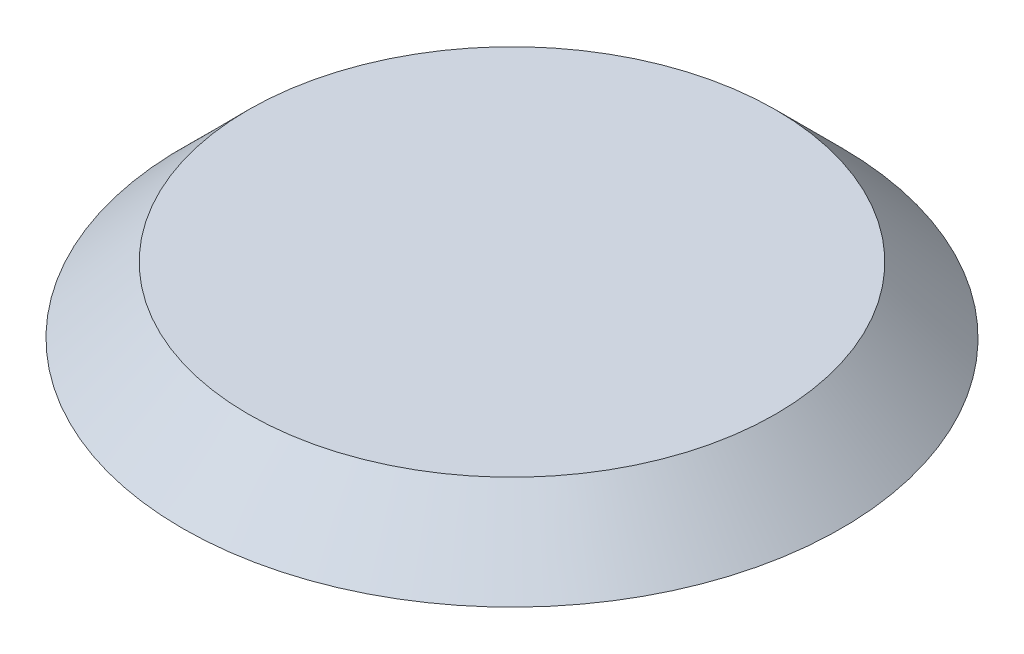
ISO-10303-21;
HEADER;
FILE_DESCRIPTION(('STEP AP214'),'2;1');
FILE_NAME('part.step','',(''),(''),'','','');
FILE_SCHEMA(('AUTOMOTIVE_DESIGN { 1 0 10303 214 1 1 1 1 }'));
ENDSEC;
DATA;
#1=APPLICATION_CONTEXT('core data for automotive mechanical design processes');
#2=APPLICATION_PROTOCOL_DEFINITION('international standard','automotive_design',2000,#1);
#3=PRODUCT_CONTEXT('',#1,'mechanical');
#4=PRODUCT('Part','Part','',(#3));
#5=PRODUCT_RELATED_PRODUCT_CATEGORY('part','',(#4));
#6=PRODUCT_DEFINITION_FORMATION('','',#4);
#7=PRODUCT_DEFINITION_CONTEXT('part definition',#1,'design');
#8=PRODUCT_DEFINITION('design','',#6,#7);
#9=PRODUCT_DEFINITION_SHAPE('','',#8);
#10=(LENGTH_UNIT() NAMED_UNIT(*) SI_UNIT(.MILLI.,.METRE.));
#11=(NAMED_UNIT(*) PLANE_ANGLE_UNIT() SI_UNIT($,.RADIAN.));
#12=(NAMED_UNIT(*) SI_UNIT($,.STERADIAN.) SOLID_ANGLE_UNIT());
#13=UNCERTAINTY_MEASURE_WITH_UNIT(LENGTH_MEASURE(1.E-05),#10,'distance_accuracy_value','');
#14=(GEOMETRIC_REPRESENTATION_CONTEXT(3) GLOBAL_UNCERTAINTY_ASSIGNED_CONTEXT((#13)) GLOBAL_UNIT_ASSIGNED_CONTEXT((#10,
#11,#12)) REPRESENTATION_CONTEXT('',''));
#15=CARTESIAN_POINT('',(0.,0.,0.));
#16=DIRECTION('',(0.,0.,1.));
#17=DIRECTION('',(1.,0.,0.));
#18=AXIS2_PLACEMENT_3D('',#15,#16,#17);
#19=CARTESIAN_POINT('',(0.,3.,0.));
#20=DIRECTION('',(0.,1.,0.));
#21=DIRECTION('',(0.,0.,1.));
#22=AXIS2_PLACEMENT_3D('',#19,#20,#21);
#23=PLANE('',#22);
#24=CARTESIAN_POINT('',(0.,3.,0.));
#25=DIRECTION('',(0.,1.,0.));
#26=DIRECTION('',(0.,0.,1.));
#27=AXIS2_PLACEMENT_3D('',#24,#25,#26);
#28=CIRCLE('',#27,12.);
#29=CARTESIAN_POINT('',(0.,3.,-12.));
#30=VERTEX_POINT('',#29);
#31=EDGE_CURVE('E10',#30,#30,#28,.T.);
#32=ORIENTED_EDGE('',*,*,#31,.T.);
#33=EDGE_LOOP('',(#32));
#34=FACE_BOUND('',#33,.T.);
#35=ADVANCED_FACE('F31',(#34),#23,.T.);
#36=CARTESIAN_POINT('',(0.,0.,0.));
#37=DIRECTION('',(0.,1.,0.));
#38=DIRECTION('',(0.,0.,1.));
#39=AXIS2_PLACEMENT_3D('',#36,#37,#38);
#40=PLANE('',#39);
#41=CARTESIAN_POINT('',(0.,0.,0.));
#42=DIRECTION('',(0.,1.,0.));
#43=DIRECTION('',(0.,0.,1.));
#44=AXIS2_PLACEMENT_3D('',#41,#42,#43);
#45=CIRCLE('',#44,15.);
#46=CARTESIAN_POINT('',(0.,0.,-15.));
#47=VERTEX_POINT('',#46);
#48=EDGE_CURVE('E38',#47,#47,#45,.T.);
#49=ORIENTED_EDGE('',*,*,#48,.F.);
#50=EDGE_LOOP('',(#49));
#51=FACE_BOUND('',#50,.T.);
#52=ADVANCED_FACE('F46',(#51),#40,.F.);
#53=CARTESIAN_POINT('',(0.,3.,0.));
#54=DIRECTION('',(0.,-1.,0.));
#55=DIRECTION('',(0.,0.,-1.));
#56=AXIS2_PLACEMENT_3D('',#53,#54,#55);
#57=CONICAL_SURFACE('',#56,12.,0.785398163397448);
#58=CARTESIAN_POINT('',(0.,0.,-15.));
#59=CARTESIAN_POINT('',(0.,0.0312499999999996,-14.96875));
#60=CARTESIAN_POINT('',(0.,0.0624999999999996,-14.9375));
#61=CARTESIAN_POINT('',(0.,0.125,-14.875));
#62=CARTESIAN_POINT('',(0.,0.15625,-14.84375));
#63=CARTESIAN_POINT('',(0.,0.21875,-14.78125));
#64=CARTESIAN_POINT('',(0.,0.25,-14.75));
#65=CARTESIAN_POINT('',(0.,0.3125,-14.6875));
#66=CARTESIAN_POINT('',(0.,0.34375,-14.65625));
#67=CARTESIAN_POINT('',(0.,0.40625,-14.59375));
#68=CARTESIAN_POINT('',(0.,0.4375,-14.5625));
#69=CARTESIAN_POINT('',(0.,0.5,-14.5));
#70=CARTESIAN_POINT('',(0.,0.53125,-14.46875));
#71=CARTESIAN_POINT('',(0.,0.59375,-14.40625));
#72=CARTESIAN_POINT('',(0.,0.625,-14.375));
#73=CARTESIAN_POINT('',(0.,0.6875,-14.3125));
#74=CARTESIAN_POINT('',(0.,0.71875,-14.28125));
#75=CARTESIAN_POINT('',(0.,0.78125,-14.21875));
#76=CARTESIAN_POINT('',(0.,0.8125,-14.1875));
#77=CARTESIAN_POINT('',(0.,0.874999999999999,-14.125));
#78=CARTESIAN_POINT('',(0.,0.90625,-14.09375));
#79=CARTESIAN_POINT('',(0.,0.96875,-14.03125));
#80=CARTESIAN_POINT('',(0.,1.,-14.));
#81=CARTESIAN_POINT('',(0.,1.0625,-13.9375));
#82=CARTESIAN_POINT('',(0.,1.09375,-13.90625));
#83=CARTESIAN_POINT('',(0.,1.15625,-13.84375));
#84=CARTESIAN_POINT('',(0.,1.1875,-13.8125));
#85=CARTESIAN_POINT('',(0.,1.25,-13.75));
#86=CARTESIAN_POINT('',(0.,1.28125,-13.71875));
#87=CARTESIAN_POINT('',(0.,1.34375,-13.65625));
#88=CARTESIAN_POINT('',(0.,1.375,-13.625));
#89=CARTESIAN_POINT('',(0.,1.4375,-13.5625));
#90=CARTESIAN_POINT('',(0.,1.46875,-13.53125));
#91=CARTESIAN_POINT('',(0.,1.53125,-13.46875));
#92=CARTESIAN_POINT('',(0.,1.5625,-13.4375));
#93=CARTESIAN_POINT('',(0.,1.625,-13.375));
#94=CARTESIAN_POINT('',(0.,1.65625,-13.34375));
#95=CARTESIAN_POINT('',(0.,1.71875,-13.28125));
#96=CARTESIAN_POINT('',(0.,1.75,-13.25));
#97=CARTESIAN_POINT('',(0.,1.8125,-13.1875));
#98=CARTESIAN_POINT('',(0.,1.84375,-13.15625));
#99=CARTESIAN_POINT('',(0.,1.90625,-13.09375));
#100=CARTESIAN_POINT('',(0.,1.9375,-13.0625));
#101=CARTESIAN_POINT('',(0.,2.,-13.));
#102=CARTESIAN_POINT('',(0.,2.03125,-12.96875));
#103=CARTESIAN_POINT('',(0.,2.09375,-12.90625));
#104=CARTESIAN_POINT('',(0.,2.125,-12.875));
#105=CARTESIAN_POINT('',(0.,2.1875,-12.8125));
#106=CARTESIAN_POINT('',(0.,2.21875,-12.78125));
#107=CARTESIAN_POINT('',(0.,2.28125,-12.71875));
#108=CARTESIAN_POINT('',(0.,2.3125,-12.6875));
#109=CARTESIAN_POINT('',(0.,2.375,-12.625));
#110=CARTESIAN_POINT('',(0.,2.40625,-12.59375));
#111=CARTESIAN_POINT('',(0.,2.46875,-12.53125));
#112=CARTESIAN_POINT('',(0.,2.5,-12.5));
#113=CARTESIAN_POINT('',(0.,2.5625,-12.4375));
#114=CARTESIAN_POINT('',(0.,2.59375,-12.40625));
#115=CARTESIAN_POINT('',(0.,2.65625,-12.34375));
#116=CARTESIAN_POINT('',(0.,2.6875,-12.3125));
#117=CARTESIAN_POINT('',(0.,2.75,-12.25));
#118=CARTESIAN_POINT('',(0.,2.78125,-12.21875));
#119=CARTESIAN_POINT('',(0.,2.84375,-12.15625));
#120=CARTESIAN_POINT('',(0.,2.875,-12.125));
#121=CARTESIAN_POINT('',(0.,2.9375,-12.0625));
#122=CARTESIAN_POINT('',(0.,2.96875,-12.03125));
#123=CARTESIAN_POINT('',(0.,3.,-12.));
#124=B_SPLINE_CURVE_WITH_KNOTS('',3,(#58,#59,#60,#61,#62,#63,#64,#65,#66,#67,#68,#69,#70,#71,
#72,#73,#74,#75,#76,#77,#78,#79,#80,#81,#82,#83,#84,#85,#86,#87,#88,#89,#90,#91,#92,#93,#94,#95,
#96,#97,#98,#99,#100,#101,#102,#103,#104,#105,#106,#107,#108,#109,#110,#111,#112,#113,#114,#115,
#116,#117,#118,#119,#120,#121,#122,#123),.UNSPECIFIED.,.F.,.F.,(4,2,2,2,2,2,2,2,2,2,2,2,2,2,2,2,
2,2,2,2,2,2,2,2,2,2,2,2,2,2,2,2,4),(0.,0.132582521472478,0.265165042944956,0.397747564417433,
0.53033008588991,0.662912607362387,0.795495128834865,0.928077650307343,1.06066017177982,
1.1932426932523,1.32582521472478,1.45840773619725,1.59099025766973,1.72357277914221,
1.85615530061469,1.98873782208716,2.12132034355964,2.25390286503212,2.3864853865046,
2.51906790797708,2.65165042944955,2.78423295092203,2.91681547239451,3.04939799386699,
3.18198051533946,3.31456303681194,3.44714555828442,3.5797280797569,3.71231060122937,
3.84489312270185,3.97747564417433,4.11005816564681,4.24264068711928),.UNSPECIFIED.);
#125=EDGE_CURVE('BSEAM33',#47,#30,#124,.T.);
#126=ORIENTED_EDGE('',*,*,#48,.T.);
#127=ORIENTED_EDGE('',*,*,#31,.F.);
#128=ORIENTED_EDGE('',*,*,#125,.T.);
#129=ORIENTED_EDGE('',*,*,#125,.F.);
#130=EDGE_LOOP('',(#126,#128,#127,#129));
#131=FACE_BOUND('',#130,.T.);
#132=ADVANCED_FACE('F33',(#131),#57,.T.);
#133=CLOSED_SHELL('',(#35,#52,#132));
#134=MANIFOLD_SOLID_BREP('B2',#133);
#135=ADVANCED_BREP_SHAPE_REPRESENTATION('',(#18,#134),#14);
#136=SHAPE_DEFINITION_REPRESENTATION(#9,#135);
ENDSEC;
END-ISO-10303-21;
